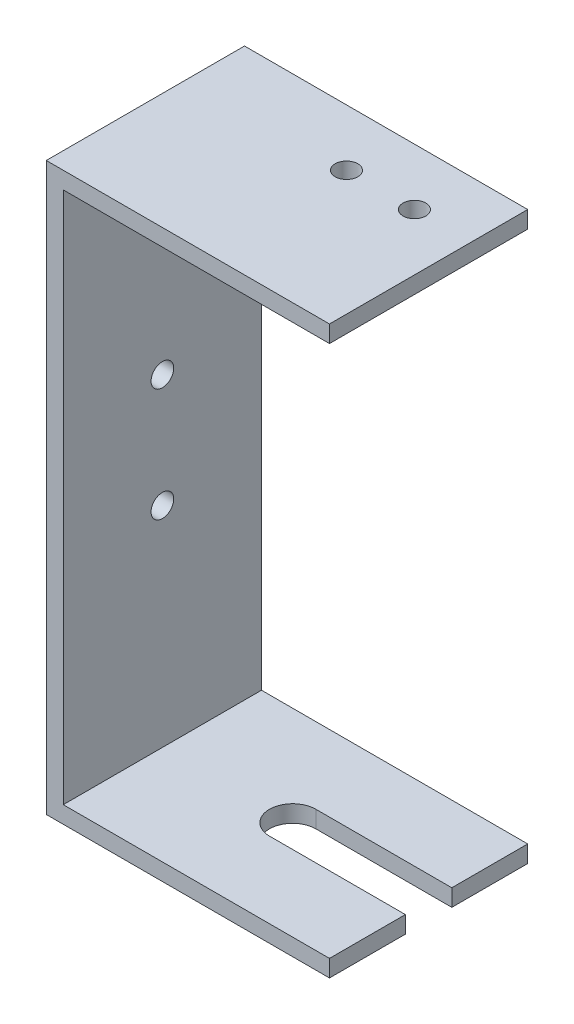
ISO-10303-21;
HEADER;
FILE_DESCRIPTION(('STEP AP214'),'2;1');
FILE_NAME('part.step','',(''),(''),'','','');
FILE_SCHEMA(('AUTOMOTIVE_DESIGN { 1 0 10303 214 1 1 1 1 }'));
ENDSEC;
DATA;
#1=APPLICATION_CONTEXT('core data for automotive mechanical design processes');
#2=APPLICATION_PROTOCOL_DEFINITION('international standard','automotive_design',2000,#1);
#3=PRODUCT_CONTEXT('',#1,'mechanical');
#4=PRODUCT('Part','Part','',(#3));
#5=PRODUCT_RELATED_PRODUCT_CATEGORY('part','',(#4));
#6=PRODUCT_DEFINITION_FORMATION('','',#4);
#7=PRODUCT_DEFINITION_CONTEXT('part definition',#1,'design');
#8=PRODUCT_DEFINITION('design','',#6,#7);
#9=PRODUCT_DEFINITION_SHAPE('','',#8);
#10=(LENGTH_UNIT() NAMED_UNIT(*) SI_UNIT(.MILLI.,.METRE.));
#11=(NAMED_UNIT(*) PLANE_ANGLE_UNIT() SI_UNIT($,.RADIAN.));
#12=(NAMED_UNIT(*) SI_UNIT($,.STERADIAN.) SOLID_ANGLE_UNIT());
#13=UNCERTAINTY_MEASURE_WITH_UNIT(LENGTH_MEASURE(1.E-05),#10,'distance_accuracy_value','');
#14=(GEOMETRIC_REPRESENTATION_CONTEXT(3) GLOBAL_UNCERTAINTY_ASSIGNED_CONTEXT((#13)) GLOBAL_UNIT_ASSIGNED_CONTEXT((#10,
#11,#12)) REPRESENTATION_CONTEXT('',''));
#15=CARTESIAN_POINT('',(0.,0.,0.));
#16=DIRECTION('',(0.,0.,1.));
#17=DIRECTION('',(1.,0.,0.));
#18=AXIS2_PLACEMENT_3D('',#15,#16,#17);
#19=CARTESIAN_POINT('',(0.,3.,35.));
#20=DIRECTION('',(-1.,0.,0.));
#21=DIRECTION('',(0.,0.,1.));
#22=AXIS2_PLACEMENT_3D('',#19,#20,#21);
#23=PLANE('',#22);
#24=DIRECTION('',(0.,0.,-1.));
#25=VECTOR('',#24,1.);
#26=CARTESIAN_POINT('',(0.,3.,35.));
#27=LINE('',#26,#25);
#28=CARTESIAN_POINT('',(0.,3.,13.4));
#29=VERTEX_POINT('',#28);
#30=CARTESIAN_POINT('',(0.,3.,0.));
#31=VERTEX_POINT('',#30);
#32=EDGE_CURVE('E40',#29,#31,#27,.T.);
#33=ORIENTED_EDGE('',*,*,#32,.F.);
#34=DIRECTION('',(0.,-1.,0.));
#35=VECTOR('',#34,1.);
#36=CARTESIAN_POINT('',(0.,100.001,13.4));
#37=LINE('',#36,#35);
#38=CARTESIAN_POINT('',(0.,0.,13.4));
#39=VERTEX_POINT('',#38);
#40=EDGE_CURVE('E219',#29,#39,#37,.T.);
#41=ORIENTED_EDGE('',*,*,#40,.T.);
#42=DIRECTION('',(0.,0.,-1.));
#43=VECTOR('',#42,1.);
#44=CARTESIAN_POINT('',(0.,0.,35.));
#45=LINE('',#44,#43);
#46=CARTESIAN_POINT('',(0.,0.,0.));
#47=VERTEX_POINT('',#46);
#48=EDGE_CURVE('E90',#39,#47,#45,.T.);
#49=ORIENTED_EDGE('',*,*,#48,.T.);
#50=DIRECTION('',(0.,1.,0.));
#51=VECTOR('',#50,1.);
#52=CARTESIAN_POINT('',(0.,3.,0.));
#53=LINE('',#52,#51);
#54=EDGE_CURVE('E141',#47,#31,#53,.T.);
#55=ORIENTED_EDGE('',*,*,#54,.T.);
#56=EDGE_LOOP('',(#33,#41,#49,#55));
#57=FACE_BOUND('',#56,.T.);
#58=ADVANCED_FACE('F32',(#57),#23,.F.);
#59=CARTESIAN_POINT('',(0.,0.,35.));
#60=VERTEX_POINT('',#59);
#61=CARTESIAN_POINT('',(0.,0.,21.6));
#62=VERTEX_POINT('',#61);
#63=EDGE_CURVE('E158',#60,#62,#45,.T.);
#64=ORIENTED_EDGE('',*,*,#63,.T.);
#65=DIRECTION('',(0.,-1.,0.));
#66=VECTOR('',#65,1.);
#67=CARTESIAN_POINT('',(0.,100.001,21.6));
#68=LINE('',#67,#66);
#69=CARTESIAN_POINT('',(0.,3.,21.6));
#70=VERTEX_POINT('',#69);
#71=EDGE_CURVE('E47',#70,#62,#68,.T.);
#72=ORIENTED_EDGE('',*,*,#71,.F.);
#73=CARTESIAN_POINT('',(0.,3.,35.));
#74=VERTEX_POINT('',#73);
#75=EDGE_CURVE('E11',#74,#70,#27,.T.);
#76=ORIENTED_EDGE('',*,*,#75,.F.);
#77=DIRECTION('',(0.,1.,0.));
#78=VECTOR('',#77,1.);
#79=CARTESIAN_POINT('',(0.,3.,35.));
#80=LINE('',#79,#78);
#81=EDGE_CURVE('E157',#60,#74,#80,.T.);
#82=ORIENTED_EDGE('',*,*,#81,.F.);
#83=EDGE_LOOP('',(#64,#72,#76,#82));
#84=FACE_BOUND('',#83,.T.);
#85=ADVANCED_FACE('F34',(#84),#23,.F.);
#86=CARTESIAN_POINT('',(0.,3.,35.));
#87=DIRECTION('',(0.,-1.,0.));
#88=DIRECTION('',(1.,0.,0.));
#89=AXIS2_PLACEMENT_3D('',#86,#87,#88);
#90=PLANE('',#89);
#91=CARTESIAN_POINT('',(-24.,3.,17.5));
#92=DIRECTION('',(0.,-1.,0.));
#93=DIRECTION('',(1.,0.,0.));
#94=AXIS2_PLACEMENT_3D('',#91,#92,#93);
#95=CIRCLE('',#94,4.1);
#96=CARTESIAN_POINT('',(-24.,3.,13.4));
#97=VERTEX_POINT('',#96);
#98=CARTESIAN_POINT('',(-24.,3.,21.6));
#99=VERTEX_POINT('',#98);
#100=EDGE_CURVE('E216',#97,#99,#95,.F.);
#101=ORIENTED_EDGE('',*,*,#100,.F.);
#102=DIRECTION('',(-1.,0.,0.));
#103=VECTOR('',#102,1.);
#104=CARTESIAN_POINT('',(0.,3.,13.4));
#105=LINE('',#104,#103);
#106=EDGE_CURVE('E180',#29,#97,#105,.T.);
#107=ORIENTED_EDGE('',*,*,#106,.F.);
#108=ORIENTED_EDGE('',*,*,#32,.T.);
#109=DIRECTION('',(-1.,0.,0.));
#110=VECTOR('',#109,1.);
#111=CARTESIAN_POINT('',(0.,3.,0.));
#112=LINE('',#111,#110);
#113=CARTESIAN_POINT('',(-47.,2.99999999999999,0.));
#114=VERTEX_POINT('',#113);
#115=EDGE_CURVE('E143',#31,#114,#112,.T.);
#116=ORIENTED_EDGE('',*,*,#115,.T.);
#117=DIRECTION('',(0.,0.,-1.));
#118=VECTOR('',#117,1.);
#119=CARTESIAN_POINT('',(-47.,2.99999999999999,35.));
#120=LINE('',#119,#118);
#121=CARTESIAN_POINT('',(-47.,2.99999999999999,35.));
#122=VERTEX_POINT('',#121);
#123=EDGE_CURVE('E168',#122,#114,#120,.T.);
#124=ORIENTED_EDGE('',*,*,#123,.F.);
#125=DIRECTION('',(-1.,0.,0.));
#126=VECTOR('',#125,1.);
#127=CARTESIAN_POINT('',(0.,3.,35.));
#128=LINE('',#127,#126);
#129=EDGE_CURVE('E98',#74,#122,#128,.T.);
#130=ORIENTED_EDGE('',*,*,#129,.F.);
#131=ORIENTED_EDGE('',*,*,#75,.T.);
#132=DIRECTION('',(1.,0.,0.));
#133=VECTOR('',#132,1.);
#134=CARTESIAN_POINT('',(-24.,3.,21.6));
#135=LINE('',#134,#133);
#136=EDGE_CURVE('E144',#99,#70,#135,.T.);
#137=ORIENTED_EDGE('',*,*,#136,.F.);
#138=EDGE_LOOP('',(#101,#107,#108,#116,#124,#130,#131,#137));
#139=FACE_BOUND('',#138,.T.);
#140=ADVANCED_FACE('F177',(#139),#90,.F.);
#141=CARTESIAN_POINT('',(-47.,2.99999999999999,35.));
#142=DIRECTION('',(-1.,0.,0.));
#143=DIRECTION('',(0.,0.,1.));
#144=AXIS2_PLACEMENT_3D('',#141,#142,#143);
#145=PLANE('',#144);
#146=CARTESIAN_POINT('',(-47.,40.,17.5));
#147=DIRECTION('',(-1.,0.,0.));
#148=DIRECTION('',(0.,0.,1.));
#149=AXIS2_PLACEMENT_3D('',#146,#147,#148);
#150=CIRCLE('',#149,2.);
#151=CARTESIAN_POINT('',(-47.,40.,19.5));
#152=VERTEX_POINT('',#151);
#153=EDGE_CURVE('E274',#152,#152,#150,.F.);
#154=ORIENTED_EDGE('',*,*,#153,.F.);
#155=EDGE_LOOP('',(#154));
#156=FACE_BOUND('',#155,.T.);
#157=CARTESIAN_POINT('',(-47.,60.,17.5));
#158=DIRECTION('',(-1.,0.,0.));
#159=DIRECTION('',(0.,0.,1.));
#160=AXIS2_PLACEMENT_3D('',#157,#158,#159);
#161=CIRCLE('',#160,2.);
#162=CARTESIAN_POINT('',(-47.,60.,19.5));
#163=VERTEX_POINT('',#162);
#164=EDGE_CURVE('E266',#163,#163,#161,.F.);
#165=ORIENTED_EDGE('',*,*,#164,.F.);
#166=EDGE_LOOP('',(#165));
#167=FACE_BOUND('',#166,.T.);
#168=DIRECTION('',(0.,1.,0.));
#169=VECTOR('',#168,1.);
#170=CARTESIAN_POINT('',(-47.,2.99999999999999,0.));
#171=LINE('',#170,#169);
#172=CARTESIAN_POINT('',(-47.,97.,0.));
#173=VERTEX_POINT('',#172);
#174=EDGE_CURVE('E146',#114,#173,#171,.T.);
#175=ORIENTED_EDGE('',*,*,#174,.T.);
#176=DIRECTION('',(0.,0.,-1.));
#177=VECTOR('',#176,1.);
#178=CARTESIAN_POINT('',(-47.,97.,35.));
#179=LINE('',#178,#177);
#180=CARTESIAN_POINT('',(-47.,97.,35.));
#181=VERTEX_POINT('',#180);
#182=EDGE_CURVE('E166',#181,#173,#179,.T.);
#183=ORIENTED_EDGE('',*,*,#182,.F.);
#184=DIRECTION('',(0.,1.,0.));
#185=VECTOR('',#184,1.);
#186=CARTESIAN_POINT('',(-47.,2.99999999999999,35.));
#187=LINE('',#186,#185);
#188=EDGE_CURVE('E227',#122,#181,#187,.T.);
#189=ORIENTED_EDGE('',*,*,#188,.F.);
#190=ORIENTED_EDGE('',*,*,#123,.T.);
#191=EDGE_LOOP('',(#175,#183,#189,#190));
#192=FACE_BOUND('',#191,.T.);
#193=ADVANCED_FACE('F194',(#156,#167,#192),#145,.F.);
#194=CARTESIAN_POINT('',(-47.,97.,35.));
#195=DIRECTION('',(0.,1.,0.));
#196=DIRECTION('',(0.,0.,1.));
#197=AXIS2_PLACEMENT_3D('',#194,#195,#196);
#198=PLANE('',#197);
#199=CARTESIAN_POINT('',(-10.,97.,10.));
#200=DIRECTION('',(0.,1.,0.));
#201=DIRECTION('',(0.,0.,1.));
#202=AXIS2_PLACEMENT_3D('',#199,#200,#201);
#203=CIRCLE('',#202,2.00000000000001);
#204=CARTESIAN_POINT('',(-10.,97.,12.));
#205=VERTEX_POINT('',#204);
#206=EDGE_CURVE('E260',#205,#205,#203,.F.);
#207=ORIENTED_EDGE('',*,*,#206,.F.);
#208=EDGE_LOOP('',(#207));
#209=FACE_BOUND('',#208,.T.);
#210=CARTESIAN_POINT('',(-22.,97.,10.));
#211=DIRECTION('',(0.,1.,0.));
#212=DIRECTION('',(0.,0.,1.));
#213=AXIS2_PLACEMENT_3D('',#210,#211,#212);
#214=CIRCLE('',#213,2.00000000000001);
#215=CARTESIAN_POINT('',(-22.,97.,12.));
#216=VERTEX_POINT('',#215);
#217=EDGE_CURVE('E224',#216,#216,#214,.F.);
#218=ORIENTED_EDGE('',*,*,#217,.F.);
#219=EDGE_LOOP('',(#218));
#220=FACE_BOUND('',#219,.T.);
#221=DIRECTION('',(1.,0.,0.));
#222=VECTOR('',#221,1.);
#223=CARTESIAN_POINT('',(-47.,97.,0.));
#224=LINE('',#223,#222);
#225=CARTESIAN_POINT('',(0.,97.,0.));
#226=VERTEX_POINT('',#225);
#227=EDGE_CURVE('E148',#173,#226,#224,.T.);
#228=ORIENTED_EDGE('',*,*,#227,.T.);
#229=DIRECTION('',(0.,0.,-1.));
#230=VECTOR('',#229,1.);
#231=CARTESIAN_POINT('',(0.,97.,35.));
#232=LINE('',#231,#230);
#233=CARTESIAN_POINT('',(0.,97.,35.));
#234=VERTEX_POINT('',#233);
#235=EDGE_CURVE('E163',#234,#226,#232,.T.);
#236=ORIENTED_EDGE('',*,*,#235,.F.);
#237=DIRECTION('',(1.,0.,0.));
#238=VECTOR('',#237,1.);
#239=CARTESIAN_POINT('',(-47.,97.,35.));
#240=LINE('',#239,#238);
#241=EDGE_CURVE('E229',#181,#234,#240,.T.);
#242=ORIENTED_EDGE('',*,*,#241,.F.);
#243=ORIENTED_EDGE('',*,*,#182,.T.);
#244=EDGE_LOOP('',(#228,#236,#242,#243));
#245=FACE_BOUND('',#244,.T.);
#246=ADVANCED_FACE('F234',(#209,#220,#245),#198,.F.);
#247=CARTESIAN_POINT('',(0.,100.,35.));
#248=DIRECTION('',(-1.,0.,0.));
#249=DIRECTION('',(0.,0.,1.));
#250=AXIS2_PLACEMENT_3D('',#247,#248,#249);
#251=PLANE('',#250);
#252=DIRECTION('',(0.,1.,0.));
#253=VECTOR('',#252,1.);
#254=CARTESIAN_POINT('',(0.,100.,0.));
#255=LINE('',#254,#253);
#256=CARTESIAN_POINT('',(0.,100.,0.));
#257=VERTEX_POINT('',#256);
#258=EDGE_CURVE('E150',#226,#257,#255,.T.);
#259=ORIENTED_EDGE('',*,*,#258,.T.);
#260=DIRECTION('',(0.,0.,-1.));
#261=VECTOR('',#260,1.);
#262=CARTESIAN_POINT('',(0.,100.,35.));
#263=LINE('',#262,#261);
#264=CARTESIAN_POINT('',(0.,100.,35.));
#265=VERTEX_POINT('',#264);
#266=EDGE_CURVE('E132',#265,#257,#263,.T.);
#267=ORIENTED_EDGE('',*,*,#266,.F.);
#268=DIRECTION('',(0.,1.,0.));
#269=VECTOR('',#268,1.);
#270=CARTESIAN_POINT('',(0.,100.,35.));
#271=LINE('',#270,#269);
#272=EDGE_CURVE('E120',#234,#265,#271,.T.);
#273=ORIENTED_EDGE('',*,*,#272,.F.);
#274=ORIENTED_EDGE('',*,*,#235,.T.);
#275=EDGE_LOOP('',(#259,#267,#273,#274));
#276=FACE_BOUND('',#275,.T.);
#277=ADVANCED_FACE('F237',(#276),#251,.F.);
#278=CARTESIAN_POINT('',(-50.,100.,35.));
#279=DIRECTION('',(0.,-1.,0.));
#280=DIRECTION('',(0.,0.,-1.));
#281=AXIS2_PLACEMENT_3D('',#278,#279,#280);
#282=PLANE('',#281);
#283=CARTESIAN_POINT('',(-10.,100.,10.));
#284=DIRECTION('',(0.,1.,0.));
#285=DIRECTION('',(0.,0.,1.));
#286=AXIS2_PLACEMENT_3D('',#283,#284,#285);
#287=CIRCLE('',#286,2.00000000000001);
#288=CARTESIAN_POINT('',(-10.,100.,12.));
#289=VERTEX_POINT('',#288);
#290=EDGE_CURVE('E263',#289,#289,#287,.T.);
#291=ORIENTED_EDGE('',*,*,#290,.F.);
#292=EDGE_LOOP('',(#291));
#293=FACE_BOUND('',#292,.T.);
#294=CARTESIAN_POINT('',(-22.,100.,10.));
#295=DIRECTION('',(0.,1.,0.));
#296=DIRECTION('',(0.,0.,1.));
#297=AXIS2_PLACEMENT_3D('',#294,#295,#296);
#298=CIRCLE('',#297,2.00000000000001);
#299=CARTESIAN_POINT('',(-22.,100.,12.));
#300=VERTEX_POINT('',#299);
#301=EDGE_CURVE('E257',#300,#300,#298,.T.);
#302=ORIENTED_EDGE('',*,*,#301,.F.);
#303=EDGE_LOOP('',(#302));
#304=FACE_BOUND('',#303,.T.);
#305=DIRECTION('',(-1.,0.,0.));
#306=VECTOR('',#305,1.);
#307=CARTESIAN_POINT('',(-50.,100.,0.));
#308=LINE('',#307,#306);
#309=CARTESIAN_POINT('',(-50.,100.,0.));
#310=VERTEX_POINT('',#309);
#311=EDGE_CURVE('E129',#257,#310,#308,.T.);
#312=ORIENTED_EDGE('',*,*,#311,.T.);
#313=DIRECTION('',(0.,0.,-1.));
#314=VECTOR('',#313,1.);
#315=CARTESIAN_POINT('',(-50.,100.,35.));
#316=LINE('',#315,#314);
#317=CARTESIAN_POINT('',(-50.,100.,35.));
#318=VERTEX_POINT('',#317);
#319=EDGE_CURVE('E126',#318,#310,#316,.T.);
#320=ORIENTED_EDGE('',*,*,#319,.F.);
#321=DIRECTION('',(-1.,0.,0.));
#322=VECTOR('',#321,1.);
#323=CARTESIAN_POINT('',(-50.,100.,35.));
#324=LINE('',#323,#322);
#325=EDGE_CURVE('E113',#265,#318,#324,.T.);
#326=ORIENTED_EDGE('',*,*,#325,.F.);
#327=ORIENTED_EDGE('',*,*,#266,.T.);
#328=EDGE_LOOP('',(#312,#320,#326,#327));
#329=FACE_BOUND('',#328,.T.);
#330=ADVANCED_FACE('F127',(#293,#304,#329),#282,.F.);
#331=CARTESIAN_POINT('',(-50.,0.,35.));
#332=DIRECTION('',(1.,0.,0.));
#333=DIRECTION('',(0.,0.,-1.));
#334=AXIS2_PLACEMENT_3D('',#331,#332,#333);
#335=PLANE('',#334);
#336=CARTESIAN_POINT('',(-50.,40.,17.5));
#337=DIRECTION('',(-1.,0.,0.));
#338=DIRECTION('',(0.,0.,1.));
#339=AXIS2_PLACEMENT_3D('',#336,#337,#338);
#340=CIRCLE('',#339,2.);
#341=CARTESIAN_POINT('',(-50.,40.,19.5));
#342=VERTEX_POINT('',#341);
#343=EDGE_CURVE('E277',#342,#342,#340,.T.);
#344=ORIENTED_EDGE('',*,*,#343,.F.);
#345=EDGE_LOOP('',(#344));
#346=FACE_BOUND('',#345,.T.);
#347=CARTESIAN_POINT('',(-50.,60.,17.5));
#348=DIRECTION('',(-1.,0.,0.));
#349=DIRECTION('',(0.,0.,1.));
#350=AXIS2_PLACEMENT_3D('',#347,#348,#349);
#351=CIRCLE('',#350,2.);
#352=CARTESIAN_POINT('',(-50.,60.,19.5));
#353=VERTEX_POINT('',#352);
#354=EDGE_CURVE('E271',#353,#353,#351,.T.);
#355=ORIENTED_EDGE('',*,*,#354,.F.);
#356=EDGE_LOOP('',(#355));
#357=FACE_BOUND('',#356,.T.);
#358=DIRECTION('',(0.,-1.,0.));
#359=VECTOR('',#358,1.);
#360=CARTESIAN_POINT('',(-50.,0.,0.));
#361=LINE('',#360,#359);
#362=CARTESIAN_POINT('',(-50.,0.,0.));
#363=VERTEX_POINT('',#362);
#364=EDGE_CURVE('E153',#310,#363,#361,.T.);
#365=ORIENTED_EDGE('',*,*,#364,.T.);
#366=DIRECTION('',(0.,0.,-1.));
#367=VECTOR('',#366,1.);
#368=CARTESIAN_POINT('',(-50.,0.,35.));
#369=LINE('',#368,#367);
#370=CARTESIAN_POINT('',(-50.,0.,35.));
#371=VERTEX_POINT('',#370);
#372=EDGE_CURVE('E133',#371,#363,#369,.T.);
#373=ORIENTED_EDGE('',*,*,#372,.F.);
#374=DIRECTION('',(0.,-1.,0.));
#375=VECTOR('',#374,1.);
#376=CARTESIAN_POINT('',(-50.,0.,35.));
#377=LINE('',#376,#375);
#378=EDGE_CURVE('E117',#318,#371,#377,.T.);
#379=ORIENTED_EDGE('',*,*,#378,.F.);
#380=ORIENTED_EDGE('',*,*,#319,.T.);
#381=EDGE_LOOP('',(#365,#373,#379,#380));
#382=FACE_BOUND('',#381,.T.);
#383=ADVANCED_FACE('F135',(#346,#357,#382),#335,.F.);
#384=CARTESIAN_POINT('',(0.,0.,35.));
#385=DIRECTION('',(0.,1.,0.));
#386=DIRECTION('',(-1.,0.,0.));
#387=AXIS2_PLACEMENT_3D('',#384,#385,#386);
#388=PLANE('',#387);
#389=ORIENTED_EDGE('',*,*,#48,.F.);
#390=DIRECTION('',(1.,0.,0.));
#391=VECTOR('',#390,1.);
#392=CARTESIAN_POINT('',(0.,0.,13.4));
#393=LINE('',#392,#391);
#394=CARTESIAN_POINT('',(-24.,0.,13.4));
#395=VERTEX_POINT('',#394);
#396=EDGE_CURVE('E208',#395,#39,#393,.T.);
#397=ORIENTED_EDGE('',*,*,#396,.F.);
#398=CARTESIAN_POINT('',(-24.,0.,17.5));
#399=DIRECTION('',(0.,-1.,0.));
#400=DIRECTION('',(-1.,0.,0.));
#401=AXIS2_PLACEMENT_3D('',#398,#399,#400);
#402=CIRCLE('',#401,4.1);
#403=CARTESIAN_POINT('',(-24.,0.,21.6));
#404=VERTEX_POINT('',#403);
#405=EDGE_CURVE('E204',#404,#395,#402,.T.);
#406=ORIENTED_EDGE('',*,*,#405,.F.);
#407=DIRECTION('',(-1.,0.,0.));
#408=VECTOR('',#407,1.);
#409=CARTESIAN_POINT('',(-24.,0.,21.6));
#410=LINE('',#409,#408);
#411=EDGE_CURVE('E200',#62,#404,#410,.T.);
#412=ORIENTED_EDGE('',*,*,#411,.F.);
#413=ORIENTED_EDGE('',*,*,#63,.F.);
#414=DIRECTION('',(1.,0.,0.));
#415=VECTOR('',#414,1.);
#416=CARTESIAN_POINT('',(0.,0.,35.));
#417=LINE('',#416,#415);
#418=EDGE_CURVE('E56',#371,#60,#417,.T.);
#419=ORIENTED_EDGE('',*,*,#418,.F.);
#420=ORIENTED_EDGE('',*,*,#372,.T.);
#421=DIRECTION('',(1.,0.,0.));
#422=VECTOR('',#421,1.);
#423=CARTESIAN_POINT('',(0.,0.,0.));
#424=LINE('',#423,#422);
#425=EDGE_CURVE('E155',#363,#47,#424,.T.);
#426=ORIENTED_EDGE('',*,*,#425,.T.);
#427=EDGE_LOOP('',(#389,#397,#406,#412,#413,#419,#420,#426));
#428=FACE_BOUND('',#427,.T.);
#429=ADVANCED_FACE('F198',(#428),#388,.F.);
#430=CARTESIAN_POINT('',(0.,0.,35.));
#431=DIRECTION('',(0.,0.,-1.));
#432=DIRECTION('',(-1.,0.,0.));
#433=AXIS2_PLACEMENT_3D('',#430,#431,#432);
#434=PLANE('',#433);
#435=ORIENTED_EDGE('',*,*,#81,.T.);
#436=ORIENTED_EDGE('',*,*,#129,.T.);
#437=ORIENTED_EDGE('',*,*,#188,.T.);
#438=ORIENTED_EDGE('',*,*,#241,.T.);
#439=ORIENTED_EDGE('',*,*,#272,.T.);
#440=ORIENTED_EDGE('',*,*,#325,.T.);
#441=ORIENTED_EDGE('',*,*,#378,.T.);
#442=ORIENTED_EDGE('',*,*,#418,.T.);
#443=EDGE_LOOP('',(#435,#436,#437,#438,#439,#440,#441,#442));
#444=FACE_BOUND('',#443,.T.);
#445=ADVANCED_FACE('F115',(#444),#434,.F.);
#446=CARTESIAN_POINT('',(0.,0.,0.));
#447=DIRECTION('',(0.,0.,-1.));
#448=DIRECTION('',(-1.,0.,0.));
#449=AXIS2_PLACEMENT_3D('',#446,#447,#448);
#450=PLANE('',#449);
#451=ORIENTED_EDGE('',*,*,#54,.F.);
#452=ORIENTED_EDGE('',*,*,#425,.F.);
#453=ORIENTED_EDGE('',*,*,#364,.F.);
#454=ORIENTED_EDGE('',*,*,#311,.F.);
#455=ORIENTED_EDGE('',*,*,#258,.F.);
#456=ORIENTED_EDGE('',*,*,#227,.F.);
#457=ORIENTED_EDGE('',*,*,#174,.F.);
#458=ORIENTED_EDGE('',*,*,#115,.F.);
#459=EDGE_LOOP('',(#451,#452,#453,#454,#455,#456,#457,#458));
#460=FACE_BOUND('',#459,.T.);
#461=ADVANCED_FACE('F183',(#460),#450,.T.);
#462=CARTESIAN_POINT('',(0.,100.001,13.4));
#463=DIRECTION('',(0.,0.,-1.));
#464=DIRECTION('',(-1.,0.,0.));
#465=AXIS2_PLACEMENT_3D('',#462,#463,#464);
#466=PLANE('',#465);
#467=ORIENTED_EDGE('',*,*,#106,.T.);
#468=DIRECTION('',(0.,-1.,0.));
#469=VECTOR('',#468,1.);
#470=CARTESIAN_POINT('',(-24.,100.001,13.4));
#471=LINE('',#470,#469);
#472=EDGE_CURVE('E211',#97,#395,#471,.T.);
#473=ORIENTED_EDGE('',*,*,#472,.T.);
#474=ORIENTED_EDGE('',*,*,#396,.T.);
#475=ORIENTED_EDGE('',*,*,#40,.F.);
#476=EDGE_LOOP('',(#467,#473,#474,#475));
#477=FACE_BOUND('',#476,.T.);
#478=ADVANCED_FACE('F315',(#477),#466,.F.);
#479=CARTESIAN_POINT('',(-24.,100.001,17.5));
#480=DIRECTION('',(0.,-1.,0.));
#481=DIRECTION('',(1.,0.,0.));
#482=AXIS2_PLACEMENT_3D('',#479,#480,#481);
#483=CYLINDRICAL_SURFACE('',#482,4.1);
#484=ORIENTED_EDGE('',*,*,#100,.T.);
#485=DIRECTION('',(0.,-1.,0.));
#486=VECTOR('',#485,1.);
#487=CARTESIAN_POINT('',(-24.,100.001,21.6));
#488=LINE('',#487,#486);
#489=EDGE_CURVE('E206',#99,#404,#488,.T.);
#490=ORIENTED_EDGE('',*,*,#489,.T.);
#491=ORIENTED_EDGE('',*,*,#405,.T.);
#492=ORIENTED_EDGE('',*,*,#472,.F.);
#493=EDGE_LOOP('',(#484,#490,#491,#492));
#494=FACE_BOUND('',#493,.T.);
#495=ADVANCED_FACE('F254',(#494),#483,.F.);
#496=CARTESIAN_POINT('',(-24.,100.001,21.6));
#497=DIRECTION('',(0.,0.,1.));
#498=DIRECTION('',(1.,0.,0.));
#499=AXIS2_PLACEMENT_3D('',#496,#497,#498);
#500=PLANE('',#499);
#501=ORIENTED_EDGE('',*,*,#136,.T.);
#502=ORIENTED_EDGE('',*,*,#71,.T.);
#503=ORIENTED_EDGE('',*,*,#411,.T.);
#504=ORIENTED_EDGE('',*,*,#489,.F.);
#505=EDGE_LOOP('',(#501,#502,#503,#504));
#506=FACE_BOUND('',#505,.T.);
#507=ADVANCED_FACE('F252',(#506),#500,.F.);
#508=CARTESIAN_POINT('',(-22.,-0.001000000000001,10.));
#509=DIRECTION('',(0.,1.,0.));
#510=DIRECTION('',(0.,0.,1.));
#511=AXIS2_PLACEMENT_3D('',#508,#509,#510);
#512=CYLINDRICAL_SURFACE('',#511,2.00000000000001);
#513=ORIENTED_EDGE('',*,*,#301,.T.);
#514=EDGE_LOOP('',(#513));
#515=FACE_BOUND('',#514,.T.);
#516=ORIENTED_EDGE('',*,*,#217,.T.);
#517=EDGE_LOOP('',(#516));
#518=FACE_BOUND('',#517,.T.);
#519=ADVANCED_FACE('F324',(#515,#518),#512,.F.);
#520=CARTESIAN_POINT('',(-10.,-0.001000000000001,10.));
#521=DIRECTION('',(0.,1.,0.));
#522=DIRECTION('',(0.,0.,1.));
#523=AXIS2_PLACEMENT_3D('',#520,#521,#522);
#524=CYLINDRICAL_SURFACE('',#523,2.00000000000001);
#525=ORIENTED_EDGE('',*,*,#290,.T.);
#526=EDGE_LOOP('',(#525));
#527=FACE_BOUND('',#526,.T.);
#528=ORIENTED_EDGE('',*,*,#206,.T.);
#529=EDGE_LOOP('',(#528));
#530=FACE_BOUND('',#529,.T.);
#531=ADVANCED_FACE('F292',(#527,#530),#524,.F.);
#532=CARTESIAN_POINT('',(0.001000000000001,60.,17.5));
#533=DIRECTION('',(-1.,0.,0.));
#534=DIRECTION('',(0.,0.,1.));
#535=AXIS2_PLACEMENT_3D('',#532,#533,#534);
#536=CYLINDRICAL_SURFACE('',#535,2.);
#537=ORIENTED_EDGE('',*,*,#354,.T.);
#538=EDGE_LOOP('',(#537));
#539=FACE_BOUND('',#538,.T.);
#540=ORIENTED_EDGE('',*,*,#164,.T.);
#541=EDGE_LOOP('',(#540));
#542=FACE_BOUND('',#541,.T.);
#543=ADVANCED_FACE('F289',(#539,#542),#536,.F.);
#544=CARTESIAN_POINT('',(0.001000000000001,40.,17.5));
#545=DIRECTION('',(-1.,0.,0.));
#546=DIRECTION('',(0.,0.,1.));
#547=AXIS2_PLACEMENT_3D('',#544,#545,#546);
#548=CYLINDRICAL_SURFACE('',#547,2.);
#549=ORIENTED_EDGE('',*,*,#343,.T.);
#550=EDGE_LOOP('',(#549));
#551=FACE_BOUND('',#550,.T.);
#552=ORIENTED_EDGE('',*,*,#153,.T.);
#553=EDGE_LOOP('',(#552));
#554=FACE_BOUND('',#553,.T.);
#555=ADVANCED_FACE('F281',(#551,#554),#548,.F.);
#556=CLOSED_SHELL('',(#58,#85,#140,#193,#246,#277,#330,#383,#429,#445,#461,#478,#495,#507,#519,
#531,#543,#555));
#557=MANIFOLD_SOLID_BREP('B2',#556);
#558=ADVANCED_BREP_SHAPE_REPRESENTATION('',(#18,#557),#14);
#559=SHAPE_DEFINITION_REPRESENTATION(#9,#558);
ENDSEC;
END-ISO-10303-21;
